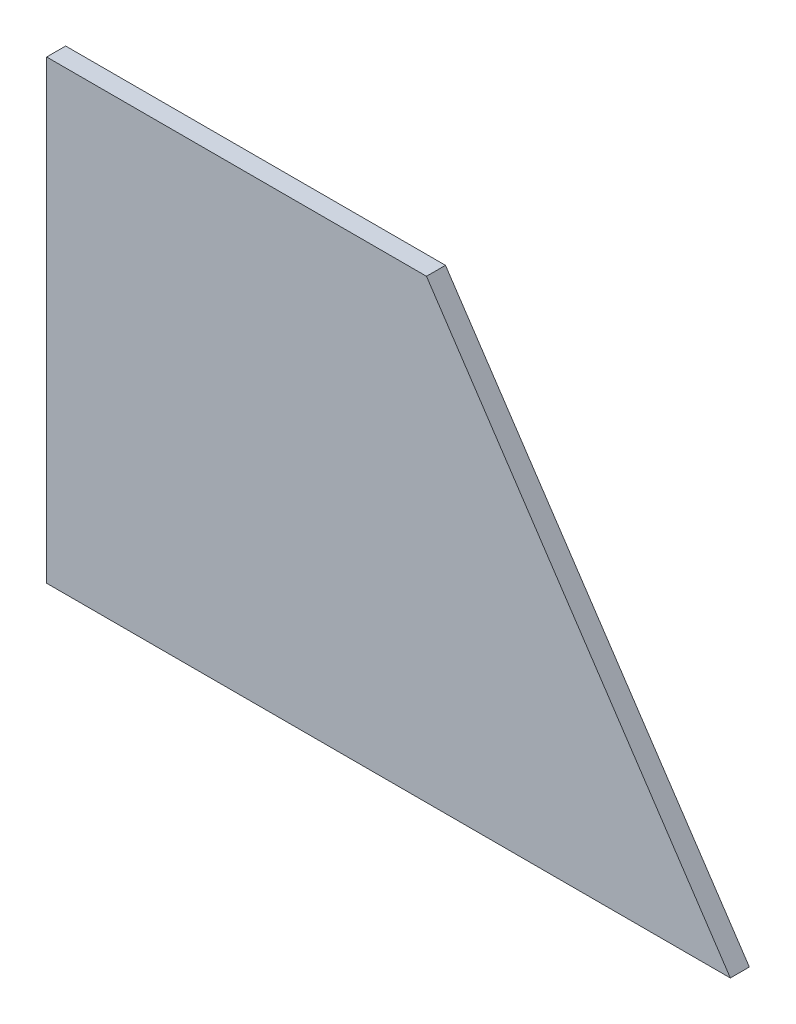
ISO-10303-21;
HEADER;
FILE_DESCRIPTION(('STEP AP214'),'2;1');
FILE_NAME('part.step','',(''),(''),'','','');
FILE_SCHEMA(('AUTOMOTIVE_DESIGN { 1 0 10303 214 1 1 1 1 }'));
ENDSEC;
DATA;
#1=APPLICATION_CONTEXT('core data for automotive mechanical design processes');
#2=APPLICATION_PROTOCOL_DEFINITION('international standard','automotive_design',2000,#1);
#3=PRODUCT_CONTEXT('',#1,'mechanical');
#4=PRODUCT('Part','Part','',(#3));
#5=PRODUCT_RELATED_PRODUCT_CATEGORY('part','',(#4));
#6=PRODUCT_DEFINITION_FORMATION('','',#4);
#7=PRODUCT_DEFINITION_CONTEXT('part definition',#1,'design');
#8=PRODUCT_DEFINITION('design','',#6,#7);
#9=PRODUCT_DEFINITION_SHAPE('','',#8);
#10=(LENGTH_UNIT() NAMED_UNIT(*) SI_UNIT(.MILLI.,.METRE.));
#11=(NAMED_UNIT(*) PLANE_ANGLE_UNIT() SI_UNIT($,.RADIAN.));
#12=(NAMED_UNIT(*) SI_UNIT($,.STERADIAN.) SOLID_ANGLE_UNIT());
#13=UNCERTAINTY_MEASURE_WITH_UNIT(LENGTH_MEASURE(1.E-05),#10,'distance_accuracy_value','');
#14=(GEOMETRIC_REPRESENTATION_CONTEXT(3) GLOBAL_UNCERTAINTY_ASSIGNED_CONTEXT((#13)) GLOBAL_UNIT_ASSIGNED_CONTEXT((#10,
#11,#12)) REPRESENTATION_CONTEXT('',''));
#15=CARTESIAN_POINT('',(0.,0.,0.));
#16=DIRECTION('',(0.,0.,1.));
#17=DIRECTION('',(1.,0.,0.));
#18=AXIS2_PLACEMENT_3D('',#15,#16,#17);
#19=CARTESIAN_POINT('',(0.,0.,3.175));
#20=DIRECTION('',(0.,1.,0.));
#21=DIRECTION('',(0.,0.,1.));
#22=AXIS2_PLACEMENT_3D('',#19,#20,#21);
#23=PLANE('',#22);
#24=DIRECTION('',(1.,0.,0.));
#25=VECTOR('',#24,1.);
#26=CARTESIAN_POINT('',(0.,0.,3.175));
#27=LINE('',#26,#25);
#28=CARTESIAN_POINT('',(50.8,0.,3.175));
#29=VERTEX_POINT('',#28);
#30=CARTESIAN_POINT('',(165.1,0.,3.175));
#31=VERTEX_POINT('',#30);
#32=EDGE_CURVE('E107',#29,#31,#27,.T.);
#33=ORIENTED_EDGE('',*,*,#32,.F.);
#34=DIRECTION('',(0.,0.,1.));
#35=VECTOR('',#34,1.);
#36=CARTESIAN_POINT('',(50.8,0.,0.));
#37=LINE('',#36,#35);
#38=CARTESIAN_POINT('',(50.8,0.,0.));
#39=VERTEX_POINT('',#38);
#40=EDGE_CURVE('E103',#39,#29,#37,.T.);
#41=ORIENTED_EDGE('',*,*,#40,.F.);
#42=DIRECTION('',(1.,0.,0.));
#43=VECTOR('',#42,1.);
#44=CARTESIAN_POINT('',(0.,0.,0.));
#45=LINE('',#44,#43);
#46=CARTESIAN_POINT('',(165.1,0.,0.));
#47=VERTEX_POINT('',#46);
#48=EDGE_CURVE('E101',#39,#47,#45,.T.);
#49=ORIENTED_EDGE('',*,*,#48,.T.);
#50=DIRECTION('',(0.,0.,-1.));
#51=VECTOR('',#50,1.);
#52=CARTESIAN_POINT('',(165.1,0.,3.175));
#53=LINE('',#52,#51);
#54=EDGE_CURVE('E11',#31,#47,#53,.T.);
#55=ORIENTED_EDGE('',*,*,#54,.F.);
#56=EDGE_LOOP('',(#33,#41,#49,#55));
#57=FACE_BOUND('',#56,.T.);
#58=ADVANCED_FACE('F45',(#57),#23,.F.);
#59=CARTESIAN_POINT('',(165.1,0.,3.175));
#60=DIRECTION('',(-0.832050294337844,-0.554700196225229,0.));
#61=DIRECTION('',(0.554700196225229,-0.832050294337844,0.));
#62=AXIS2_PLACEMENT_3D('',#59,#60,#61);
#63=PLANE('',#62);
#64=DIRECTION('',(-0.554700196225229,0.832050294337844,0.));
#65=VECTOR('',#64,1.);
#66=CARTESIAN_POINT('',(165.1,0.,0.));
#67=LINE('',#66,#65);
#68=CARTESIAN_POINT('',(114.3,76.2,0.));
#69=VERTEX_POINT('',#68);
#70=EDGE_CURVE('E74',#47,#69,#67,.T.);
#71=ORIENTED_EDGE('',*,*,#70,.T.);
#72=DIRECTION('',(0.,0.,-1.));
#73=VECTOR('',#72,1.);
#74=CARTESIAN_POINT('',(114.3,76.2,3.175));
#75=LINE('',#74,#73);
#76=CARTESIAN_POINT('',(114.3,76.2,3.175));
#77=VERTEX_POINT('',#76);
#78=EDGE_CURVE('E54',#77,#69,#75,.T.);
#79=ORIENTED_EDGE('',*,*,#78,.F.);
#80=DIRECTION('',(-0.554700196225229,0.832050294337844,0.));
#81=VECTOR('',#80,1.);
#82=CARTESIAN_POINT('',(165.1,0.,3.175));
#83=LINE('',#82,#81);
#84=EDGE_CURVE('E62',#31,#77,#83,.T.);
#85=ORIENTED_EDGE('',*,*,#84,.F.);
#86=ORIENTED_EDGE('',*,*,#54,.T.);
#87=EDGE_LOOP('',(#71,#79,#85,#86));
#88=FACE_BOUND('',#87,.T.);
#89=ADVANCED_FACE('F130',(#88),#63,.F.);
#90=CARTESIAN_POINT('',(114.3,76.2,3.175));
#91=DIRECTION('',(0.,-1.,0.));
#92=DIRECTION('',(1.,0.,0.));
#93=AXIS2_PLACEMENT_3D('',#90,#91,#92);
#94=PLANE('',#93);
#95=DIRECTION('',(-1.,0.,0.));
#96=VECTOR('',#95,1.);
#97=CARTESIAN_POINT('',(114.3,76.2,0.));
#98=LINE('',#97,#96);
#99=CARTESIAN_POINT('',(50.8,76.2,0.));
#100=VERTEX_POINT('',#99);
#101=EDGE_CURVE('E100',#69,#100,#98,.T.);
#102=ORIENTED_EDGE('',*,*,#101,.T.);
#103=DIRECTION('',(0.,0.,-1.));
#104=VECTOR('',#103,1.);
#105=CARTESIAN_POINT('',(50.8,76.2,3.175));
#106=LINE('',#105,#104);
#107=CARTESIAN_POINT('',(50.8,76.2,3.175));
#108=VERTEX_POINT('',#107);
#109=EDGE_CURVE('E81',#108,#100,#106,.T.);
#110=ORIENTED_EDGE('',*,*,#109,.F.);
#111=DIRECTION('',(-1.,0.,0.));
#112=VECTOR('',#111,1.);
#113=CARTESIAN_POINT('',(114.3,76.2,3.175));
#114=LINE('',#113,#112);
#115=EDGE_CURVE('E94',#77,#108,#114,.T.);
#116=ORIENTED_EDGE('',*,*,#115,.F.);
#117=ORIENTED_EDGE('',*,*,#78,.T.);
#118=EDGE_LOOP('',(#102,#110,#116,#117));
#119=FACE_BOUND('',#118,.T.);
#120=ADVANCED_FACE('F105',(#119),#94,.F.);
#121=CARTESIAN_POINT('',(0.,0.,3.175));
#122=DIRECTION('',(0.,0.,1.));
#123=DIRECTION('',(1.,0.,0.));
#124=AXIS2_PLACEMENT_3D('',#121,#122,#123);
#125=PLANE('',#124);
#126=DIRECTION('',(0.,1.,0.));
#127=VECTOR('',#126,1.);
#128=CARTESIAN_POINT('',(50.8,76.2,3.175));
#129=LINE('',#128,#127);
#130=EDGE_CURVE('E89',#29,#108,#129,.T.);
#131=ORIENTED_EDGE('',*,*,#130,.F.);
#132=ORIENTED_EDGE('',*,*,#32,.T.);
#133=ORIENTED_EDGE('',*,*,#84,.T.);
#134=ORIENTED_EDGE('',*,*,#115,.T.);
#135=EDGE_LOOP('',(#131,#132,#133,#134));
#136=FACE_BOUND('',#135,.T.);
#137=ADVANCED_FACE('F129',(#136),#125,.T.);
#138=CARTESIAN_POINT('',(0.,0.,0.));
#139=DIRECTION('',(0.,0.,1.));
#140=DIRECTION('',(1.,0.,0.));
#141=AXIS2_PLACEMENT_3D('',#138,#139,#140);
#142=PLANE('',#141);
#143=ORIENTED_EDGE('',*,*,#48,.F.);
#144=DIRECTION('',(0.,1.,0.));
#145=VECTOR('',#144,1.);
#146=CARTESIAN_POINT('',(50.8,76.2,0.));
#147=LINE('',#146,#145);
#148=EDGE_CURVE('E85',#39,#100,#147,.T.);
#149=ORIENTED_EDGE('',*,*,#148,.T.);
#150=ORIENTED_EDGE('',*,*,#101,.F.);
#151=ORIENTED_EDGE('',*,*,#70,.F.);
#152=EDGE_LOOP('',(#143,#149,#150,#151));
#153=FACE_BOUND('',#152,.T.);
#154=ADVANCED_FACE('F99',(#153),#142,.F.);
#155=CARTESIAN_POINT('',(50.8,76.2,0.));
#156=DIRECTION('',(1.,0.,0.));
#157=DIRECTION('',(0.,1.,0.));
#158=AXIS2_PLACEMENT_3D('',#155,#156,#157);
#159=PLANE('',#158);
#160=ORIENTED_EDGE('',*,*,#130,.T.);
#161=ORIENTED_EDGE('',*,*,#109,.T.);
#162=ORIENTED_EDGE('',*,*,#148,.F.);
#163=ORIENTED_EDGE('',*,*,#40,.T.);
#164=EDGE_LOOP('',(#160,#161,#162,#163));
#165=FACE_BOUND('',#164,.T.);
#166=ADVANCED_FACE('F83',(#165),#159,.F.);
#167=CLOSED_SHELL('',(#58,#89,#120,#137,#154,#166));
#168=MANIFOLD_SOLID_BREP('B2',#167);
#169=ADVANCED_BREP_SHAPE_REPRESENTATION('',(#18,#168),#14);
#170=SHAPE_DEFINITION_REPRESENTATION(#9,#169);
ENDSEC;
END-ISO-10303-21;
